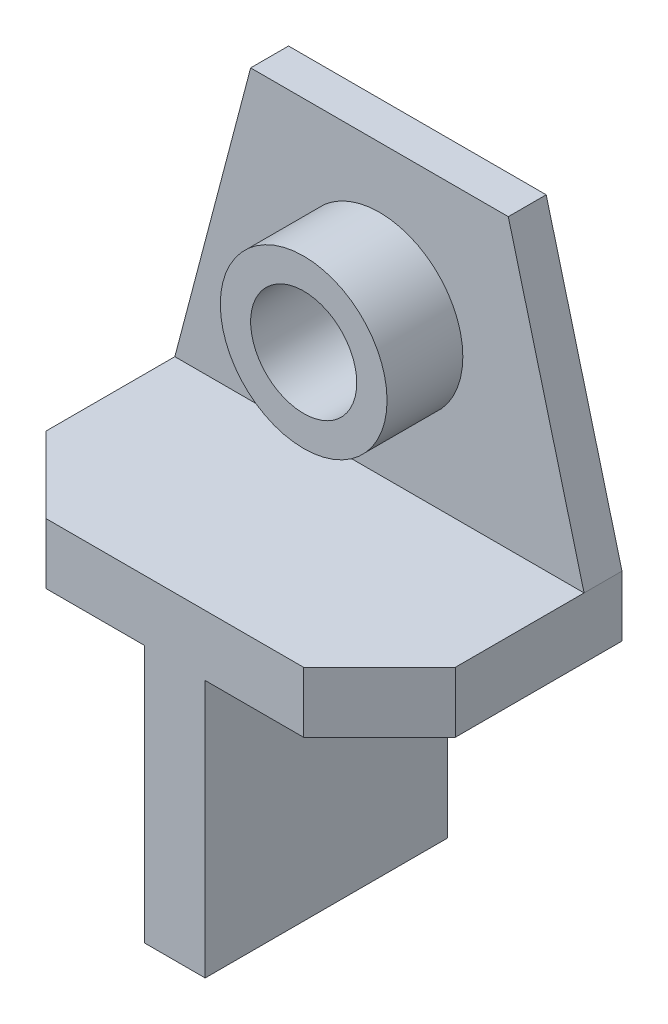
ISO-10303-21;
HEADER;
FILE_DESCRIPTION(('STEP AP214'),'2;1');
FILE_NAME('part.step','',(''),(''),'','','');
FILE_SCHEMA(('AUTOMOTIVE_DESIGN { 1 0 10303 214 1 1 1 1 }'));
ENDSEC;
DATA;
#1=APPLICATION_CONTEXT('core data for automotive mechanical design processes');
#2=APPLICATION_PROTOCOL_DEFINITION('international standard','automotive_design',2000,#1);
#3=PRODUCT_CONTEXT('',#1,'mechanical');
#4=PRODUCT('Part','Part','',(#3));
#5=PRODUCT_RELATED_PRODUCT_CATEGORY('part','',(#4));
#6=PRODUCT_DEFINITION_FORMATION('','',#4);
#7=PRODUCT_DEFINITION_CONTEXT('part definition',#1,'design');
#8=PRODUCT_DEFINITION('design','',#6,#7);
#9=PRODUCT_DEFINITION_SHAPE('','',#8);
#10=(LENGTH_UNIT() NAMED_UNIT(*) SI_UNIT(.MILLI.,.METRE.));
#11=(NAMED_UNIT(*) PLANE_ANGLE_UNIT() SI_UNIT($,.RADIAN.));
#12=(NAMED_UNIT(*) SI_UNIT($,.STERADIAN.) SOLID_ANGLE_UNIT());
#13=UNCERTAINTY_MEASURE_WITH_UNIT(LENGTH_MEASURE(1.E-05),#10,'distance_accuracy_value','');
#14=(GEOMETRIC_REPRESENTATION_CONTEXT(3) GLOBAL_UNCERTAINTY_ASSIGNED_CONTEXT((#13)) GLOBAL_UNIT_ASSIGNED_CONTEXT((#10,
#11,#12)) REPRESENTATION_CONTEXT('',''));
#15=CARTESIAN_POINT('',(0.,0.,0.));
#16=DIRECTION('',(0.,0.,1.));
#17=DIRECTION('',(1.,0.,0.));
#18=AXIS2_PLACEMENT_3D('',#15,#16,#17);
#19=CARTESIAN_POINT('',(0.,0.,16.));
#20=DIRECTION('',(0.,-1.,0.));
#21=DIRECTION('',(0.,0.,-1.));
#22=AXIS2_PLACEMENT_3D('',#19,#20,#21);
#23=PLANE('',#22);
#24=DIRECTION('',(-1.,0.,0.));
#25=VECTOR('',#24,1.);
#26=CARTESIAN_POINT('',(0.,0.,16.));
#27=LINE('',#26,#25);
#28=CARTESIAN_POINT('',(44.,0.,16.));
#29=VERTEX_POINT('',#28);
#30=CARTESIAN_POINT('',(10.,0.,16.));
#31=VERTEX_POINT('',#30);
#32=EDGE_CURVE('E156',#29,#31,#27,.T.);
#33=ORIENTED_EDGE('',*,*,#32,.F.);
#34=DIRECTION('',(-0.707106781186548,0.,0.707106781186547));
#35=VECTOR('',#34,1.);
#36=CARTESIAN_POINT('',(44.,0.,16.));
#37=LINE('',#36,#35);
#38=CARTESIAN_POINT('',(54.,0.,6.));
#39=VERTEX_POINT('',#38);
#40=EDGE_CURVE('E247',#39,#29,#37,.T.);
#41=ORIENTED_EDGE('',*,*,#40,.F.);
#42=DIRECTION('',(0.,0.,-1.));
#43=VECTOR('',#42,1.);
#44=CARTESIAN_POINT('',(54.,0.,16.));
#45=LINE('',#44,#43);
#46=CARTESIAN_POINT('',(54.,0.,-11.));
#47=VERTEX_POINT('',#46);
#48=EDGE_CURVE('E155',#39,#47,#45,.T.);
#49=ORIENTED_EDGE('',*,*,#48,.T.);
#50=DIRECTION('',(1.,0.,0.));
#51=VECTOR('',#50,1.);
#52=CARTESIAN_POINT('',(54.,0.,-11.));
#53=LINE('',#52,#51);
#54=CARTESIAN_POINT('',(0.,0.,-11.));
#55=VERTEX_POINT('',#54);
#56=EDGE_CURVE('E143',#55,#47,#53,.T.);
#57=ORIENTED_EDGE('',*,*,#56,.F.);
#58=DIRECTION('',(0.,0.,-1.));
#59=VECTOR('',#58,1.);
#60=CARTESIAN_POINT('',(0.,0.,16.));
#61=LINE('',#60,#59);
#62=CARTESIAN_POINT('',(0.,0.,6.));
#63=VERTEX_POINT('',#62);
#64=EDGE_CURVE('E150',#63,#55,#61,.T.);
#65=ORIENTED_EDGE('',*,*,#64,.F.);
#66=DIRECTION('',(-0.707106781186548,0.,-0.707106781186548));
#67=VECTOR('',#66,1.);
#68=CARTESIAN_POINT('',(10.,0.,16.));
#69=LINE('',#68,#67);
#70=EDGE_CURVE('E250',#31,#63,#69,.T.);
#71=ORIENTED_EDGE('',*,*,#70,.F.);
#72=EDGE_LOOP('',(#33,#41,#49,#57,#65,#71));
#73=FACE_BOUND('',#72,.T.);
#74=ADVANCED_FACE('F37',(#73),#23,.F.);
#75=CARTESIAN_POINT('',(0.,-8.00000000000001,16.));
#76=DIRECTION('',(1.,0.,0.));
#77=DIRECTION('',(0.,0.,-1.));
#78=AXIS2_PLACEMENT_3D('',#75,#76,#77);
#79=PLANE('',#78);
#80=ORIENTED_EDGE('',*,*,#64,.T.);
#81=DIRECTION('',(0.,0.,1.));
#82=VECTOR('',#81,1.);
#83=CARTESIAN_POINT('',(0.,0.,-21.));
#84=LINE('',#83,#82);
#85=CARTESIAN_POINT('',(0.,0.,-16.));
#86=VERTEX_POINT('',#85);
#87=EDGE_CURVE('E129',#86,#55,#84,.T.);
#88=ORIENTED_EDGE('',*,*,#87,.F.);
#89=DIRECTION('',(0.,-1.,0.));
#90=VECTOR('',#89,1.);
#91=CARTESIAN_POINT('',(0.,-8.00000000000001,-16.));
#92=LINE('',#91,#90);
#93=CARTESIAN_POINT('',(0.,-8.00000000000001,-16.));
#94=VERTEX_POINT('',#93);
#95=EDGE_CURVE('E185',#86,#94,#92,.T.);
#96=ORIENTED_EDGE('',*,*,#95,.T.);
#97=DIRECTION('',(0.,0.,-1.));
#98=VECTOR('',#97,1.);
#99=CARTESIAN_POINT('',(0.,-8.00000000000001,16.));
#100=LINE('',#99,#98);
#101=CARTESIAN_POINT('',(0.,-8.00000000000001,6.));
#102=VERTEX_POINT('',#101);
#103=EDGE_CURVE('E215',#102,#94,#100,.T.);
#104=ORIENTED_EDGE('',*,*,#103,.F.);
#105=DIRECTION('',(0.,1.,0.));
#106=VECTOR('',#105,1.);
#107=CARTESIAN_POINT('',(0.,-10.,6.));
#108=LINE('',#107,#106);
#109=EDGE_CURVE('E152',#102,#63,#108,.T.);
#110=ORIENTED_EDGE('',*,*,#109,.T.);
#111=EDGE_LOOP('',(#80,#88,#96,#104,#110));
#112=FACE_BOUND('',#111,.T.);
#113=ADVANCED_FACE('F39',(#112),#79,.F.);
#114=CARTESIAN_POINT('',(23.,-8.,16.));
#115=DIRECTION('',(0.,1.,0.));
#116=DIRECTION('',(-1.,0.,0.));
#117=AXIS2_PLACEMENT_3D('',#114,#115,#116);
#118=PLANE('',#117);
#119=DIRECTION('',(1.,0.,0.));
#120=VECTOR('',#119,1.);
#121=CARTESIAN_POINT('',(23.,-8.,16.));
#122=LINE('',#121,#120);
#123=CARTESIAN_POINT('',(10.,-8.00000000000001,16.));
#124=VERTEX_POINT('',#123);
#125=CARTESIAN_POINT('',(23.,-8.,16.));
#126=VERTEX_POINT('',#125);
#127=EDGE_CURVE('E171',#124,#126,#122,.T.);
#128=ORIENTED_EDGE('',*,*,#127,.F.);
#129=DIRECTION('',(-0.707106781186548,0.,-0.707106781186548));
#130=VECTOR('',#129,1.);
#131=CARTESIAN_POINT('',(16.5,-8.00000000000001,22.5));
#132=LINE('',#131,#130);
#133=EDGE_CURVE('E167',#124,#102,#132,.T.);
#134=ORIENTED_EDGE('',*,*,#133,.T.);
#135=ORIENTED_EDGE('',*,*,#103,.T.);
#136=DIRECTION('',(1.,0.,0.));
#137=VECTOR('',#136,1.);
#138=CARTESIAN_POINT('',(23.,-8.,-16.));
#139=LINE('',#138,#137);
#140=CARTESIAN_POINT('',(23.,-8.,-16.));
#141=VERTEX_POINT('',#140);
#142=EDGE_CURVE('E187',#94,#141,#139,.T.);
#143=ORIENTED_EDGE('',*,*,#142,.T.);
#144=DIRECTION('',(0.,0.,-1.));
#145=VECTOR('',#144,1.);
#146=CARTESIAN_POINT('',(23.,-8.,16.));
#147=LINE('',#146,#145);
#148=EDGE_CURVE('E212',#126,#141,#147,.T.);
#149=ORIENTED_EDGE('',*,*,#148,.F.);
#150=EDGE_LOOP('',(#128,#134,#135,#143,#149));
#151=FACE_BOUND('',#150,.T.);
#152=ADVANCED_FACE('F257',(#151),#118,.F.);
#153=CARTESIAN_POINT('',(23.,-42.,16.));
#154=DIRECTION('',(1.,0.,0.));
#155=DIRECTION('',(0.,1.,0.));
#156=AXIS2_PLACEMENT_3D('',#153,#154,#155);
#157=PLANE('',#156);
#158=DIRECTION('',(0.,-1.,0.));
#159=VECTOR('',#158,1.);
#160=CARTESIAN_POINT('',(23.,-42.,-16.));
#161=LINE('',#160,#159);
#162=CARTESIAN_POINT('',(23.,-42.,-16.));
#163=VERTEX_POINT('',#162);
#164=EDGE_CURVE('E189',#141,#163,#161,.T.);
#165=ORIENTED_EDGE('',*,*,#164,.T.);
#166=DIRECTION('',(0.,0.,-1.));
#167=VECTOR('',#166,1.);
#168=CARTESIAN_POINT('',(23.,-42.,16.));
#169=LINE('',#168,#167);
#170=CARTESIAN_POINT('',(23.,-42.,16.));
#171=VERTEX_POINT('',#170);
#172=EDGE_CURVE('E209',#171,#163,#169,.T.);
#173=ORIENTED_EDGE('',*,*,#172,.F.);
#174=DIRECTION('',(0.,-1.,0.));
#175=VECTOR('',#174,1.);
#176=CARTESIAN_POINT('',(23.,-42.,16.));
#177=LINE('',#176,#175);
#178=EDGE_CURVE('E173',#126,#171,#177,.T.);
#179=ORIENTED_EDGE('',*,*,#178,.F.);
#180=ORIENTED_EDGE('',*,*,#148,.T.);
#181=EDGE_LOOP('',(#165,#173,#179,#180));
#182=FACE_BOUND('',#181,.T.);
#183=ADVANCED_FACE('F305',(#182),#157,.F.);
#184=CARTESIAN_POINT('',(31.,-42.,16.));
#185=DIRECTION('',(0.,1.,0.));
#186=DIRECTION('',(0.,0.,1.));
#187=AXIS2_PLACEMENT_3D('',#184,#185,#186);
#188=PLANE('',#187);
#189=DIRECTION('',(1.,0.,0.));
#190=VECTOR('',#189,1.);
#191=CARTESIAN_POINT('',(31.,-42.,-16.));
#192=LINE('',#191,#190);
#193=CARTESIAN_POINT('',(31.,-42.,-16.));
#194=VERTEX_POINT('',#193);
#195=EDGE_CURVE('E191',#163,#194,#192,.T.);
#196=ORIENTED_EDGE('',*,*,#195,.T.);
#197=DIRECTION('',(0.,0.,-1.));
#198=VECTOR('',#197,1.);
#199=CARTESIAN_POINT('',(31.,-42.,16.));
#200=LINE('',#199,#198);
#201=CARTESIAN_POINT('',(31.,-42.,16.));
#202=VERTEX_POINT('',#201);
#203=EDGE_CURVE('E206',#202,#194,#200,.T.);
#204=ORIENTED_EDGE('',*,*,#203,.F.);
#205=DIRECTION('',(1.,0.,0.));
#206=VECTOR('',#205,1.);
#207=CARTESIAN_POINT('',(31.,-42.,16.));
#208=LINE('',#207,#206);
#209=EDGE_CURVE('E176',#171,#202,#208,.T.);
#210=ORIENTED_EDGE('',*,*,#209,.F.);
#211=ORIENTED_EDGE('',*,*,#172,.T.);
#212=EDGE_LOOP('',(#196,#204,#210,#211));
#213=FACE_BOUND('',#212,.T.);
#214=ADVANCED_FACE('F301',(#213),#188,.F.);
#215=CARTESIAN_POINT('',(31.,-8.,16.));
#216=DIRECTION('',(-1.,0.,0.));
#217=DIRECTION('',(0.,-1.,0.));
#218=AXIS2_PLACEMENT_3D('',#215,#216,#217);
#219=PLANE('',#218);
#220=DIRECTION('',(0.,1.,0.));
#221=VECTOR('',#220,1.);
#222=CARTESIAN_POINT('',(31.,-8.,-16.));
#223=LINE('',#222,#221);
#224=CARTESIAN_POINT('',(31.,-8.,-16.));
#225=VERTEX_POINT('',#224);
#226=EDGE_CURVE('E193',#194,#225,#223,.T.);
#227=ORIENTED_EDGE('',*,*,#226,.T.);
#228=DIRECTION('',(0.,0.,-1.));
#229=VECTOR('',#228,1.);
#230=CARTESIAN_POINT('',(31.,-8.,16.));
#231=LINE('',#230,#229);
#232=CARTESIAN_POINT('',(31.,-8.,16.));
#233=VERTEX_POINT('',#232);
#234=EDGE_CURVE('E203',#233,#225,#231,.T.);
#235=ORIENTED_EDGE('',*,*,#234,.F.);
#236=DIRECTION('',(0.,1.,0.));
#237=VECTOR('',#236,1.);
#238=CARTESIAN_POINT('',(31.,-8.,16.));
#239=LINE('',#238,#237);
#240=EDGE_CURVE('E178',#202,#233,#239,.T.);
#241=ORIENTED_EDGE('',*,*,#240,.F.);
#242=ORIENTED_EDGE('',*,*,#203,.T.);
#243=EDGE_LOOP('',(#227,#235,#241,#242));
#244=FACE_BOUND('',#243,.T.);
#245=ADVANCED_FACE('F297',(#244),#219,.F.);
#246=CARTESIAN_POINT('',(54.,-8.,16.));
#247=DIRECTION('',(0.,1.,0.));
#248=DIRECTION('',(-1.,0.,0.));
#249=AXIS2_PLACEMENT_3D('',#246,#247,#248);
#250=PLANE('',#249);
#251=DIRECTION('',(0.,0.,-1.));
#252=VECTOR('',#251,1.);
#253=CARTESIAN_POINT('',(54.,-8.,16.));
#254=LINE('',#253,#252);
#255=CARTESIAN_POINT('',(54.,-8.,6.));
#256=VERTEX_POINT('',#255);
#257=CARTESIAN_POINT('',(54.,-8.,-16.));
#258=VERTEX_POINT('',#257);
#259=EDGE_CURVE('E201',#256,#258,#254,.T.);
#260=ORIENTED_EDGE('',*,*,#259,.F.);
#261=DIRECTION('',(-0.707106781186548,0.,0.707106781186547));
#262=VECTOR('',#261,1.);
#263=CARTESIAN_POINT('',(49.,-8.,11.));
#264=LINE('',#263,#262);
#265=CARTESIAN_POINT('',(44.,-8.,16.));
#266=VERTEX_POINT('',#265);
#267=EDGE_CURVE('E162',#256,#266,#264,.T.);
#268=ORIENTED_EDGE('',*,*,#267,.T.);
#269=DIRECTION('',(1.,0.,0.));
#270=VECTOR('',#269,1.);
#271=CARTESIAN_POINT('',(54.,-8.,16.));
#272=LINE('',#271,#270);
#273=EDGE_CURVE('E180',#233,#266,#272,.T.);
#274=ORIENTED_EDGE('',*,*,#273,.F.);
#275=ORIENTED_EDGE('',*,*,#234,.T.);
#276=DIRECTION('',(1.,0.,0.));
#277=VECTOR('',#276,1.);
#278=CARTESIAN_POINT('',(54.,-8.,-16.));
#279=LINE('',#278,#277);
#280=EDGE_CURVE('E195',#225,#258,#279,.T.);
#281=ORIENTED_EDGE('',*,*,#280,.T.);
#282=EDGE_LOOP('',(#260,#268,#274,#275,#281));
#283=FACE_BOUND('',#282,.T.);
#284=ADVANCED_FACE('F294',(#283),#250,.F.);
#285=CARTESIAN_POINT('',(54.,0.,16.));
#286=DIRECTION('',(-1.,0.,0.));
#287=DIRECTION('',(0.,0.,1.));
#288=AXIS2_PLACEMENT_3D('',#285,#286,#287);
#289=PLANE('',#288);
#290=DIRECTION('',(0.,1.,0.));
#291=VECTOR('',#290,1.);
#292=CARTESIAN_POINT('',(54.,0.,-16.));
#293=LINE('',#292,#291);
#294=CARTESIAN_POINT('',(54.,0.,-16.));
#295=VERTEX_POINT('',#294);
#296=EDGE_CURVE('E174',#258,#295,#293,.T.);
#297=ORIENTED_EDGE('',*,*,#296,.T.);
#298=DIRECTION('',(0.,0.,1.));
#299=VECTOR('',#298,1.);
#300=CARTESIAN_POINT('',(54.,0.,-21.));
#301=LINE('',#300,#299);
#302=EDGE_CURVE('E269',#295,#47,#301,.T.);
#303=ORIENTED_EDGE('',*,*,#302,.T.);
#304=ORIENTED_EDGE('',*,*,#48,.F.);
#305=DIRECTION('',(0.,1.,0.));
#306=VECTOR('',#305,1.);
#307=CARTESIAN_POINT('',(54.,-10.,6.));
#308=LINE('',#307,#306);
#309=EDGE_CURVE('E249',#256,#39,#308,.T.);
#310=ORIENTED_EDGE('',*,*,#309,.F.);
#311=ORIENTED_EDGE('',*,*,#259,.T.);
#312=EDGE_LOOP('',(#297,#303,#304,#310,#311));
#313=FACE_BOUND('',#312,.T.);
#314=ADVANCED_FACE('F267',(#313),#289,.F.);
#315=CARTESIAN_POINT('',(0.,0.,16.));
#316=DIRECTION('',(0.,0.,-1.));
#317=DIRECTION('',(-1.,0.,0.));
#318=AXIS2_PLACEMENT_3D('',#315,#316,#317);
#319=PLANE('',#318);
#320=ORIENTED_EDGE('',*,*,#273,.T.);
#321=DIRECTION('',(0.,1.,0.));
#322=VECTOR('',#321,1.);
#323=CARTESIAN_POINT('',(44.,0.,16.));
#324=LINE('',#323,#322);
#325=EDGE_CURVE('E221',#266,#29,#324,.T.);
#326=ORIENTED_EDGE('',*,*,#325,.T.);
#327=ORIENTED_EDGE('',*,*,#32,.T.);
#328=DIRECTION('',(0.,-1.,0.));
#329=VECTOR('',#328,1.);
#330=CARTESIAN_POINT('',(10.,0.,16.));
#331=LINE('',#330,#329);
#332=EDGE_CURVE('E218',#31,#124,#331,.T.);
#333=ORIENTED_EDGE('',*,*,#332,.T.);
#334=ORIENTED_EDGE('',*,*,#127,.T.);
#335=ORIENTED_EDGE('',*,*,#178,.T.);
#336=ORIENTED_EDGE('',*,*,#209,.T.);
#337=ORIENTED_EDGE('',*,*,#240,.T.);
#338=EDGE_LOOP('',(#320,#326,#327,#333,#334,#335,#336,#337));
#339=FACE_BOUND('',#338,.T.);
#340=ADVANCED_FACE('F262',(#339),#319,.F.);
#341=CARTESIAN_POINT('',(0.,0.,-16.));
#342=DIRECTION('',(0.,0.,-1.));
#343=DIRECTION('',(-1.,0.,0.));
#344=AXIS2_PLACEMENT_3D('',#341,#342,#343);
#345=PLANE('',#344);
#346=DIRECTION('',(-0.254493299279644,-0.967074537262647,0.));
#347=VECTOR('',#346,1.);
#348=CARTESIAN_POINT('',(0.,0.,-16.));
#349=LINE('',#348,#347);
#350=CARTESIAN_POINT('',(10.,38.,-16.));
#351=VERTEX_POINT('',#350);
#352=EDGE_CURVE('E132',#351,#86,#349,.T.);
#353=ORIENTED_EDGE('',*,*,#352,.F.);
#354=DIRECTION('',(-1.,0.,0.));
#355=VECTOR('',#354,1.);
#356=CARTESIAN_POINT('',(0.,38.,-16.));
#357=LINE('',#356,#355);
#358=CARTESIAN_POINT('',(44.,38.,-16.));
#359=VERTEX_POINT('',#358);
#360=EDGE_CURVE('E164',#359,#351,#357,.T.);
#361=ORIENTED_EDGE('',*,*,#360,.F.);
#362=DIRECTION('',(-0.254493299279644,0.967074537262647,0.));
#363=VECTOR('',#362,1.);
#364=CARTESIAN_POINT('',(50.5025906735751,13.2901554404145,-16.));
#365=LINE('',#364,#363);
#366=EDGE_CURVE('E52',#295,#359,#365,.T.);
#367=ORIENTED_EDGE('',*,*,#366,.F.);
#368=ORIENTED_EDGE('',*,*,#296,.F.);
#369=ORIENTED_EDGE('',*,*,#280,.F.);
#370=ORIENTED_EDGE('',*,*,#226,.F.);
#371=ORIENTED_EDGE('',*,*,#195,.F.);
#372=ORIENTED_EDGE('',*,*,#164,.F.);
#373=ORIENTED_EDGE('',*,*,#142,.F.);
#374=ORIENTED_EDGE('',*,*,#95,.F.);
#375=EDGE_LOOP('',(#353,#361,#367,#368,#369,#370,#371,#372,#373,#374));
#376=FACE_BOUND('',#375,.T.);
#377=ADVANCED_FACE('F231',(#376),#345,.T.);
#378=CARTESIAN_POINT('',(54.,38.,-11.));
#379=DIRECTION('',(0.,0.,-1.));
#380=DIRECTION('',(-1.,0.,0.));
#381=AXIS2_PLACEMENT_3D('',#378,#379,#380);
#382=PLANE('',#381);
#383=CARTESIAN_POINT('',(27.,19.,-11.));
#384=DIRECTION('',(0.,0.,-1.));
#385=DIRECTION('',(-1.,0.,0.));
#386=AXIS2_PLACEMENT_3D('',#383,#384,#385);
#387=CIRCLE('',#386,11.);
#388=CARTESIAN_POINT('',(16.,19.,-11.));
#389=VERTEX_POINT('',#388);
#390=EDGE_CURVE('E224',#389,#389,#387,.F.);
#391=ORIENTED_EDGE('',*,*,#390,.F.);
#392=EDGE_LOOP('',(#391));
#393=FACE_BOUND('',#392,.T.);
#394=DIRECTION('',(1.,0.,0.));
#395=VECTOR('',#394,1.);
#396=CARTESIAN_POINT('',(54.,38.,-11.));
#397=LINE('',#396,#395);
#398=CARTESIAN_POINT('',(10.,38.,-11.));
#399=VERTEX_POINT('',#398);
#400=CARTESIAN_POINT('',(44.,38.,-11.));
#401=VERTEX_POINT('',#400);
#402=EDGE_CURVE('E145',#399,#401,#397,.T.);
#403=ORIENTED_EDGE('',*,*,#402,.F.);
#404=DIRECTION('',(0.254493299279644,0.967074537262646,0.));
#405=VECTOR('',#404,1.);
#406=CARTESIAN_POINT('',(0.,0.,-11.));
#407=LINE('',#406,#405);
#408=EDGE_CURVE('E60',#55,#399,#407,.T.);
#409=ORIENTED_EDGE('',*,*,#408,.F.);
#410=ORIENTED_EDGE('',*,*,#56,.T.);
#411=DIRECTION('',(0.254493299279644,-0.967074537262646,0.));
#412=VECTOR('',#411,1.);
#413=CARTESIAN_POINT('',(54.,0.,-11.));
#414=LINE('',#413,#412);
#415=EDGE_CURVE('E146',#401,#47,#414,.T.);
#416=ORIENTED_EDGE('',*,*,#415,.F.);
#417=EDGE_LOOP('',(#403,#409,#410,#416));
#418=FACE_BOUND('',#417,.T.);
#419=ADVANCED_FACE('F140',(#393,#418),#382,.F.);
#420=CARTESIAN_POINT('',(0.,38.,0.));
#421=DIRECTION('',(0.,-1.,0.));
#422=DIRECTION('',(0.,0.,-1.));
#423=AXIS2_PLACEMENT_3D('',#420,#421,#422);
#424=PLANE('',#423);
#425=ORIENTED_EDGE('',*,*,#360,.T.);
#426=DIRECTION('',(0.,0.,1.));
#427=VECTOR('',#426,1.);
#428=CARTESIAN_POINT('',(10.,38.,0.));
#429=LINE('',#428,#427);
#430=EDGE_CURVE('E11',#351,#399,#429,.T.);
#431=ORIENTED_EDGE('',*,*,#430,.T.);
#432=ORIENTED_EDGE('',*,*,#402,.T.);
#433=DIRECTION('',(0.,0.,-1.));
#434=VECTOR('',#433,1.);
#435=CARTESIAN_POINT('',(44.,38.,0.));
#436=LINE('',#435,#434);
#437=EDGE_CURVE('E45',#401,#359,#436,.T.);
#438=ORIENTED_EDGE('',*,*,#437,.T.);
#439=EDGE_LOOP('',(#425,#431,#432,#438));
#440=FACE_BOUND('',#439,.T.);
#441=ADVANCED_FACE('F229',(#440),#424,.F.);
#442=CARTESIAN_POINT('',(10.,-10.,16.));
#443=DIRECTION('',(0.707106781186548,0.,-0.707106781186548));
#444=DIRECTION('',(-0.707106781186548,0.,-0.707106781186548));
#445=AXIS2_PLACEMENT_3D('',#442,#443,#444);
#446=PLANE('',#445);
#447=ORIENTED_EDGE('',*,*,#332,.F.);
#448=ORIENTED_EDGE('',*,*,#70,.T.);
#449=ORIENTED_EDGE('',*,*,#109,.F.);
#450=ORIENTED_EDGE('',*,*,#133,.F.);
#451=EDGE_LOOP('',(#447,#448,#449,#450));
#452=FACE_BOUND('',#451,.T.);
#453=ADVANCED_FACE('F260',(#452),#446,.F.);
#454=CARTESIAN_POINT('',(44.,-10.,16.));
#455=DIRECTION('',(-0.707106781186547,0.,-0.707106781186548));
#456=DIRECTION('',(-0.707106781186548,0.,0.707106781186547));
#457=AXIS2_PLACEMENT_3D('',#454,#455,#456);
#458=PLANE('',#457);
#459=ORIENTED_EDGE('',*,*,#309,.T.);
#460=ORIENTED_EDGE('',*,*,#40,.T.);
#461=ORIENTED_EDGE('',*,*,#325,.F.);
#462=ORIENTED_EDGE('',*,*,#267,.F.);
#463=EDGE_LOOP('',(#459,#460,#461,#462));
#464=FACE_BOUND('',#463,.T.);
#465=ADVANCED_FACE('F362',(#464),#458,.F.);
#466=CARTESIAN_POINT('',(27.,19.,-0.999999999999994));
#467=DIRECTION('',(0.,0.,1.));
#468=DIRECTION('',(1.,0.,0.));
#469=AXIS2_PLACEMENT_3D('',#466,#467,#468);
#470=PLANE('',#469);
#471=CARTESIAN_POINT('',(27.,19.,-0.999999999999994));
#472=DIRECTION('',(0.,0.,1.));
#473=DIRECTION('',(1.,0.,0.));
#474=AXIS2_PLACEMENT_3D('',#471,#472,#473);
#475=CIRCLE('',#474,11.);
#476=CARTESIAN_POINT('',(38.,19.,-0.999999999999994));
#477=VERTEX_POINT('',#476);
#478=EDGE_CURVE('E243',#477,#477,#475,.T.);
#479=ORIENTED_EDGE('',*,*,#478,.T.);
#480=EDGE_LOOP('',(#479));
#481=FACE_BOUND('',#480,.T.);
#482=CARTESIAN_POINT('',(27.,19.,-0.999999999999994));
#483=DIRECTION('',(0.,0.,1.));
#484=DIRECTION('',(1.,0.,0.));
#485=AXIS2_PLACEMENT_3D('',#482,#483,#484);
#486=CIRCLE('',#485,7.);
#487=CARTESIAN_POINT('',(34.,19.,-0.999999999999994));
#488=VERTEX_POINT('',#487);
#489=EDGE_CURVE('E237',#488,#488,#486,.T.);
#490=ORIENTED_EDGE('',*,*,#489,.F.);
#491=EDGE_LOOP('',(#490));
#492=FACE_BOUND('',#491,.T.);
#493=ADVANCED_FACE('F369',(#481,#492),#470,.T.);
#494=CARTESIAN_POINT('',(27.,19.,-0.999999999999994));
#495=DIRECTION('',(0.,0.,-1.));
#496=DIRECTION('',(-1.,0.,0.));
#497=AXIS2_PLACEMENT_3D('',#494,#495,#496);
#498=CYLINDRICAL_SURFACE('',#497,11.);
#499=ORIENTED_EDGE('',*,*,#478,.F.);
#500=EDGE_LOOP('',(#499));
#501=FACE_BOUND('',#500,.T.);
#502=ORIENTED_EDGE('',*,*,#390,.T.);
#503=EDGE_LOOP('',(#502));
#504=FACE_BOUND('',#503,.T.);
#505=ADVANCED_FACE('F376',(#501,#504),#498,.T.);
#506=CARTESIAN_POINT('',(27.,19.,-0.999999999999994));
#507=DIRECTION('',(0.,0.,-1.));
#508=DIRECTION('',(-1.,0.,0.));
#509=AXIS2_PLACEMENT_3D('',#506,#507,#508);
#510=CYLINDRICAL_SURFACE('',#509,7.);
#511=ORIENTED_EDGE('',*,*,#489,.T.);
#512=EDGE_LOOP('',(#511));
#513=FACE_BOUND('',#512,.T.);
#514=CARTESIAN_POINT('',(27.,19.,-11.));
#515=DIRECTION('',(0.,0.,1.));
#516=DIRECTION('',(1.,0.,0.));
#517=AXIS2_PLACEMENT_3D('',#514,#515,#516);
#518=CIRCLE('',#517,7.);
#519=CARTESIAN_POINT('',(34.,19.,-11.));
#520=VERTEX_POINT('',#519);
#521=EDGE_CURVE('E234',#520,#520,#518,.T.);
#522=ORIENTED_EDGE('',*,*,#521,.F.);
#523=EDGE_LOOP('',(#522));
#524=FACE_BOUND('',#523,.T.);
#525=ADVANCED_FACE('F280',(#513,#524),#510,.F.);
#526=ORIENTED_EDGE('',*,*,#521,.T.);
#527=EDGE_LOOP('',(#526));
#528=FACE_BOUND('',#527,.T.);
#529=ADVANCED_FACE('F273',(#528),#382,.F.);
#530=CARTESIAN_POINT('',(54.,0.,-21.));
#531=DIRECTION('',(-0.967074537262646,-0.254493299279644,0.));
#532=DIRECTION('',(0.254493299279644,-0.967074537262647,0.));
#533=AXIS2_PLACEMENT_3D('',#530,#531,#532);
#534=PLANE('',#533);
#535=ORIENTED_EDGE('',*,*,#366,.T.);
#536=ORIENTED_EDGE('',*,*,#437,.F.);
#537=ORIENTED_EDGE('',*,*,#415,.T.);
#538=ORIENTED_EDGE('',*,*,#302,.F.);
#539=EDGE_LOOP('',(#535,#536,#537,#538));
#540=FACE_BOUND('',#539,.T.);
#541=ADVANCED_FACE('F271',(#540),#534,.F.);
#542=CARTESIAN_POINT('',(0.,0.,-21.));
#543=DIRECTION('',(0.967074537262646,-0.254493299279644,0.));
#544=DIRECTION('',(0.254493299279644,0.967074537262647,0.));
#545=AXIS2_PLACEMENT_3D('',#542,#543,#544);
#546=PLANE('',#545);
#547=ORIENTED_EDGE('',*,*,#352,.T.);
#548=ORIENTED_EDGE('',*,*,#87,.T.);
#549=ORIENTED_EDGE('',*,*,#408,.T.);
#550=ORIENTED_EDGE('',*,*,#430,.F.);
#551=EDGE_LOOP('',(#547,#548,#549,#550));
#552=FACE_BOUND('',#551,.T.);
#553=ADVANCED_FACE('F130',(#552),#546,.F.);
#554=CLOSED_SHELL('',(#74,#113,#152,#183,#214,#245,#284,#314,#340,#377,#419,#441,#453,#465,#493,
#505,#525,#529,#541,#553));
#555=MANIFOLD_SOLID_BREP('B2',#554);
#556=ADVANCED_BREP_SHAPE_REPRESENTATION('',(#18,#555),#14);
#557=SHAPE_DEFINITION_REPRESENTATION(#9,#556);
ENDSEC;
END-ISO-10303-21;
